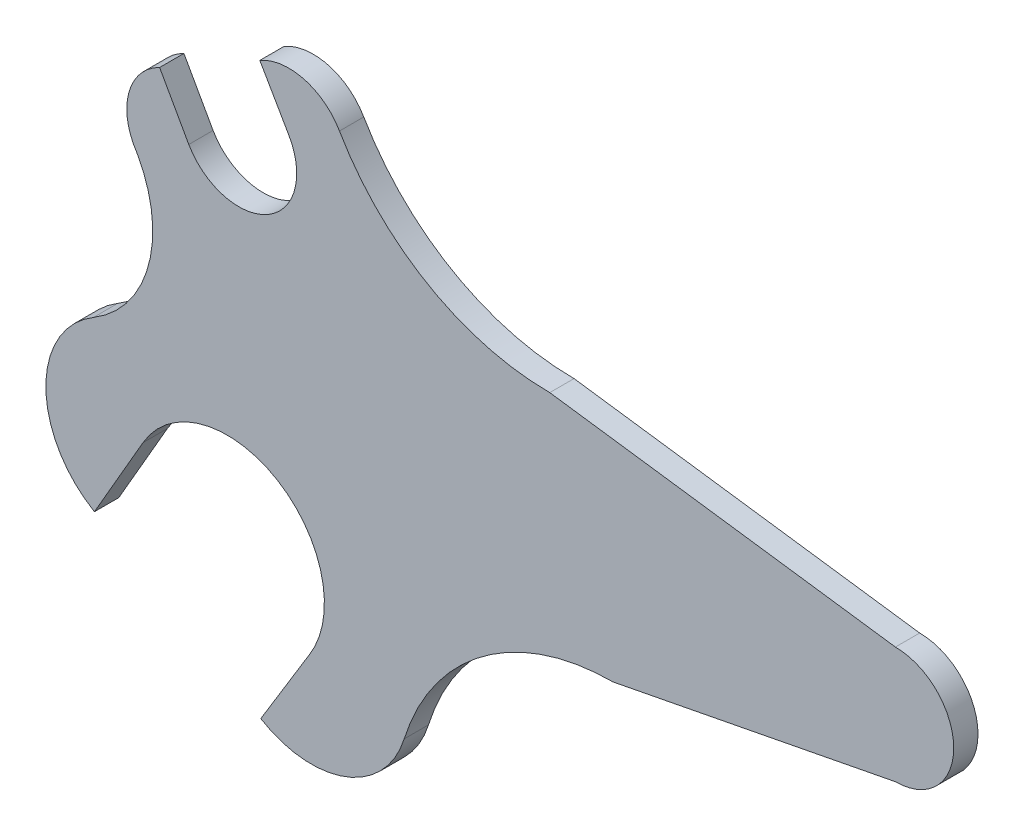
ISO-10303-21;
HEADER;
FILE_DESCRIPTION(('STEP AP214'),'2;1');
FILE_NAME('part.step','',(''),(''),'','','');
FILE_SCHEMA(('AUTOMOTIVE_DESIGN { 1 0 10303 214 1 1 1 1 }'));
ENDSEC;
DATA;
#1=APPLICATION_CONTEXT('core data for automotive mechanical design processes');
#2=APPLICATION_PROTOCOL_DEFINITION('international standard','automotive_design',2000,#1);
#3=PRODUCT_CONTEXT('',#1,'mechanical');
#4=PRODUCT('Part','Part','',(#3));
#5=PRODUCT_RELATED_PRODUCT_CATEGORY('part','',(#4));
#6=PRODUCT_DEFINITION_FORMATION('','',#4);
#7=PRODUCT_DEFINITION_CONTEXT('part definition',#1,'design');
#8=PRODUCT_DEFINITION('design','',#6,#7);
#9=PRODUCT_DEFINITION_SHAPE('','',#8);
#10=(LENGTH_UNIT() NAMED_UNIT(*) SI_UNIT(.MILLI.,.METRE.));
#11=(NAMED_UNIT(*) PLANE_ANGLE_UNIT() SI_UNIT($,.RADIAN.));
#12=(NAMED_UNIT(*) SI_UNIT($,.STERADIAN.) SOLID_ANGLE_UNIT());
#13=UNCERTAINTY_MEASURE_WITH_UNIT(LENGTH_MEASURE(1.E-05),#10,'distance_accuracy_value','');
#14=(GEOMETRIC_REPRESENTATION_CONTEXT(3) GLOBAL_UNCERTAINTY_ASSIGNED_CONTEXT((#13)) GLOBAL_UNIT_ASSIGNED_CONTEXT((#10,
#11,#12)) REPRESENTATION_CONTEXT('',''));
#15=CARTESIAN_POINT('',(0.,0.,0.));
#16=DIRECTION('',(0.,0.,1.));
#17=DIRECTION('',(1.,0.,0.));
#18=AXIS2_PLACEMENT_3D('',#15,#16,#17);
#19=CARTESIAN_POINT('',(43.8745570055947,71.7506218130229,5.));
#20=DIRECTION('',(0.,0.,-1.));
#21=DIRECTION('',(-1.,0.,0.));
#22=AXIS2_PLACEMENT_3D('',#19,#20,#21);
#23=CYLINDRICAL_SURFACE('',#22,49.9671061811762);
#24=CARTESIAN_POINT('',(43.8745570055947,71.7506218130229,0.));
#25=DIRECTION('',(0.,0.,1.));
#26=DIRECTION('',(1.,0.,0.));
#27=AXIS2_PLACEMENT_3D('',#24,#25,#26);
#28=CIRCLE('',#27,49.9671061811762);
#29=CARTESIAN_POINT('',(0.601773699101533,46.767068722435,0.));
#30=VERTEX_POINT('',#29);
#31=CARTESIAN_POINT('',(43.8745570055943,21.7835156318467,0.));
#32=VERTEX_POINT('',#31);
#33=EDGE_CURVE('E174',#30,#32,#28,.T.);
#34=ORIENTED_EDGE('',*,*,#33,.F.);
#35=DIRECTION('',(0.,0.,-1.));
#36=VECTOR('',#35,1.);
#37=CARTESIAN_POINT('',(0.601773699101533,46.767068722435,5.));
#38=LINE('',#37,#36);
#39=CARTESIAN_POINT('',(0.601773699101533,46.767068722435,5.));
#40=VERTEX_POINT('',#39);
#41=EDGE_CURVE('E11',#40,#30,#38,.T.);
#42=ORIENTED_EDGE('',*,*,#41,.F.);
#43=CARTESIAN_POINT('',(43.8745570055947,71.7506218130229,5.));
#44=DIRECTION('',(0.,0.,1.));
#45=DIRECTION('',(1.,0.,0.));
#46=AXIS2_PLACEMENT_3D('',#43,#44,#45);
#47=CIRCLE('',#46,49.9671061811762);
#48=CARTESIAN_POINT('',(43.8745570055943,21.7835156318467,5.));
#49=VERTEX_POINT('',#48);
#50=EDGE_CURVE('E217',#40,#49,#47,.T.);
#51=ORIENTED_EDGE('',*,*,#50,.T.);
#52=DIRECTION('',(0.,0.,-1.));
#53=VECTOR('',#52,1.);
#54=CARTESIAN_POINT('',(43.8745570055943,21.7835156318467,5.));
#55=LINE('',#54,#53);
#56=EDGE_CURVE('E49',#49,#32,#55,.T.);
#57=ORIENTED_EDGE('',*,*,#56,.T.);
#58=EDGE_LOOP('',(#34,#42,#51,#57));
#59=FACE_BOUND('',#58,.T.);
#60=ADVANCED_FACE('F33',(#59),#23,.F.);
#61=CARTESIAN_POINT('',(-9.79053114631223,40.7670687224347,5.));
#62=DIRECTION('',(0.,0.,-1.));
#63=DIRECTION('',(-1.,0.,0.));
#64=AXIS2_PLACEMENT_3D('',#61,#62,#63);
#65=CYLINDRICAL_SURFACE('',#64,12.0000000000006);
#66=CARTESIAN_POINT('',(-9.79053114631223,40.7670687224347,0.));
#67=DIRECTION('',(0.,0.,1.));
#68=DIRECTION('',(1.,0.,0.));
#69=AXIS2_PLACEMENT_3D('',#66,#67,#68);
#70=CIRCLE('',#69,12.0000000000006);
#71=CARTESIAN_POINT('',(-15.7905311463125,51.1593735678485,0.));
#72=VERTEX_POINT('',#71);
#73=EDGE_CURVE('E176',#30,#72,#70,.T.);
#74=ORIENTED_EDGE('',*,*,#73,.T.);
#75=DIRECTION('',(0.,0.,-1.));
#76=VECTOR('',#75,1.);
#77=CARTESIAN_POINT('',(-15.7905311463125,51.1593735678485,5.));
#78=LINE('',#77,#76);
#79=CARTESIAN_POINT('',(-15.7905311463125,51.1593735678485,5.));
#80=VERTEX_POINT('',#79);
#81=EDGE_CURVE('E41',#80,#72,#78,.T.);
#82=ORIENTED_EDGE('',*,*,#81,.F.);
#83=CARTESIAN_POINT('',(-9.79053114631223,40.7670687224347,5.));
#84=DIRECTION('',(0.,0.,1.));
#85=DIRECTION('',(1.,0.,0.));
#86=AXIS2_PLACEMENT_3D('',#83,#84,#85);
#87=CIRCLE('',#86,12.0000000000006);
#88=EDGE_CURVE('E263',#40,#80,#87,.T.);
#89=ORIENTED_EDGE('',*,*,#88,.F.);
#90=ORIENTED_EDGE('',*,*,#41,.T.);
#91=EDGE_LOOP('',(#74,#82,#89,#90));
#92=FACE_BOUND('',#91,.T.);
#93=ADVANCED_FACE('F250',(#92),#65,.T.);
#94=CARTESIAN_POINT('',(10.309760215993,5.95234283598398,5.));
#95=DIRECTION('',(-0.866025403784441,-0.499999999999997,0.));
#96=DIRECTION('',(0.499999999999997,-0.866025403784441,0.));
#97=AXIS2_PLACEMENT_3D('',#94,#95,#96);
#98=PLANE('',#97);
#99=DIRECTION('',(-0.499999999999997,0.866025403784441,0.));
#100=VECTOR('',#99,1.);
#101=CARTESIAN_POINT('',(10.309760215993,5.95234283598398,0.));
#102=LINE('',#101,#100);
#103=CARTESIAN_POINT('',(-9.79053114631223,40.7670687224347,0.));
#104=VERTEX_POINT('',#103);
#105=EDGE_CURVE('E179',#104,#72,#102,.T.);
#106=ORIENTED_EDGE('',*,*,#105,.F.);
#107=DIRECTION('',(0.,0.,-1.));
#108=VECTOR('',#107,1.);
#109=CARTESIAN_POINT('',(-9.79053114631223,40.7670687224347,5.));
#110=LINE('',#109,#108);
#111=CARTESIAN_POINT('',(-9.79053114631223,40.7670687224347,5.));
#112=VERTEX_POINT('',#111);
#113=EDGE_CURVE('E240',#112,#104,#110,.T.);
#114=ORIENTED_EDGE('',*,*,#113,.F.);
#115=DIRECTION('',(-0.499999999999997,0.866025403784441,0.));
#116=VECTOR('',#115,1.);
#117=CARTESIAN_POINT('',(10.309760215993,5.95234283598398,5.));
#118=LINE('',#117,#116);
#119=EDGE_CURVE('E247',#112,#80,#118,.T.);
#120=ORIENTED_EDGE('',*,*,#119,.T.);
#121=ORIENTED_EDGE('',*,*,#81,.T.);
#122=EDGE_LOOP('',(#106,#114,#120,#121));
#123=FACE_BOUND('',#122,.T.);
#124=ADVANCED_FACE('F245',(#123),#98,.T.);
#125=CARTESIAN_POINT('',(-20.1002913623053,34.8147258864507,5.));
#126=DIRECTION('',(0.,0.,-1.));
#127=DIRECTION('',(-1.,0.,0.));
#128=AXIS2_PLACEMENT_3D('',#125,#126,#127);
#129=CYLINDRICAL_SURFACE('',#128,11.9046856719681);
#130=CARTESIAN_POINT('',(-20.1002913623053,34.8147258864507,0.));
#131=DIRECTION('',(0.,0.,1.));
#132=DIRECTION('',(1.,0.,0.));
#133=AXIS2_PLACEMENT_3D('',#130,#131,#132);
#134=CIRCLE('',#133,11.9046856719681);
#135=CARTESIAN_POINT('',(-30.4100515782983,28.8623830504667,0.));
#136=VERTEX_POINT('',#135);
#137=EDGE_CURVE('E182',#136,#104,#134,.T.);
#138=ORIENTED_EDGE('',*,*,#137,.F.);
#139=DIRECTION('',(0.,0.,-1.));
#140=VECTOR('',#139,1.);
#141=CARTESIAN_POINT('',(-30.4100515782983,28.8623830504667,5.));
#142=LINE('',#141,#140);
#143=CARTESIAN_POINT('',(-30.4100515782983,28.8623830504667,5.));
#144=VERTEX_POINT('',#143);
#145=EDGE_CURVE('E238',#144,#136,#142,.T.);
#146=ORIENTED_EDGE('',*,*,#145,.F.);
#147=CARTESIAN_POINT('',(-20.1002913623053,34.8147258864507,5.));
#148=DIRECTION('',(0.,0.,1.));
#149=DIRECTION('',(1.,0.,0.));
#150=AXIS2_PLACEMENT_3D('',#147,#148,#149);
#151=CIRCLE('',#150,11.9046856719681);
#152=EDGE_CURVE('E260',#144,#112,#151,.T.);
#153=ORIENTED_EDGE('',*,*,#152,.T.);
#154=ORIENTED_EDGE('',*,*,#113,.T.);
#155=EDGE_LOOP('',(#138,#146,#153,#154));
#156=FACE_BOUND('',#155,.T.);
#157=ADVANCED_FACE('F257',(#156),#129,.F.);
#158=CARTESIAN_POINT('',(-10.8655081469604,-6.07784757268126,5.));
#159=DIRECTION('',(0.872740028325754,0.488185254752704,0.));
#160=DIRECTION('',(-0.488185254752704,0.872740028325754,0.));
#161=AXIS2_PLACEMENT_3D('',#158,#159,#160);
#162=PLANE('',#161);
#163=DIRECTION('',(0.488185254752704,-0.872740028325754,0.));
#164=VECTOR('',#163,1.);
#165=CARTESIAN_POINT('',(-10.8655081469604,-6.07784757268126,0.));
#166=LINE('',#165,#164);
#167=CARTESIAN_POINT('',(-36.4100515782988,39.5887212980394,0.));
#168=VERTEX_POINT('',#167);
#169=EDGE_CURVE('E185',#168,#136,#166,.T.);
#170=ORIENTED_EDGE('',*,*,#169,.F.);
#171=DIRECTION('',(0.,0.,-1.));
#172=VECTOR('',#171,1.);
#173=CARTESIAN_POINT('',(-36.4100515782988,39.5887212980394,5.));
#174=LINE('',#173,#172);
#175=CARTESIAN_POINT('',(-36.4100515782988,39.5887212980394,5.));
#176=VERTEX_POINT('',#175);
#177=EDGE_CURVE('E236',#176,#168,#174,.T.);
#178=ORIENTED_EDGE('',*,*,#177,.F.);
#179=DIRECTION('',(0.488185254752704,-0.872740028325754,0.));
#180=VECTOR('',#179,1.);
#181=CARTESIAN_POINT('',(-10.8655081469604,-6.07784757268126,5.));
#182=LINE('',#181,#180);
#183=EDGE_CURVE('E265',#176,#144,#182,.T.);
#184=ORIENTED_EDGE('',*,*,#183,.T.);
#185=ORIENTED_EDGE('',*,*,#145,.T.);
#186=EDGE_LOOP('',(#170,#178,#184,#185));
#187=FACE_BOUND('',#186,.T.);
#188=ADVANCED_FACE('F313',(#187),#162,.T.);
#189=CARTESIAN_POINT('',(-31.1619704743754,28.7971669740939,5.));
#190=DIRECTION('',(0.,0.,-1.));
#191=DIRECTION('',(-1.,0.,0.));
#192=AXIS2_PLACEMENT_3D('',#189,#190,#191);
#193=CYLINDRICAL_SURFACE('',#192,12.000000000001);
#194=CARTESIAN_POINT('',(-31.1619704743754,28.7971669740939,0.));
#195=DIRECTION('',(0.,0.,1.));
#196=DIRECTION('',(1.,0.,0.));
#197=AXIS2_PLACEMENT_3D('',#194,#195,#196);
#198=CIRCLE('',#197,12.000000000001);
#199=CARTESIAN_POINT('',(-41.0763656568723,22.036636805142,0.));
#200=VERTEX_POINT('',#199);
#201=EDGE_CURVE('E188',#168,#200,#198,.T.);
#202=ORIENTED_EDGE('',*,*,#201,.T.);
#203=DIRECTION('',(0.,0.,-1.));
#204=VECTOR('',#203,1.);
#205=CARTESIAN_POINT('',(-41.0763656568723,22.036636805142,5.));
#206=LINE('',#205,#204);
#207=CARTESIAN_POINT('',(-41.0763656568723,22.036636805142,5.));
#208=VERTEX_POINT('',#207);
#209=EDGE_CURVE('E234',#208,#200,#206,.T.);
#210=ORIENTED_EDGE('',*,*,#209,.F.);
#211=CARTESIAN_POINT('',(-31.1619704743754,28.7971669740939,5.));
#212=DIRECTION('',(0.,0.,1.));
#213=DIRECTION('',(1.,0.,0.));
#214=AXIS2_PLACEMENT_3D('',#211,#212,#213);
#215=CIRCLE('',#214,12.000000000001);
#216=EDGE_CURVE('E271',#176,#208,#215,.T.);
#217=ORIENTED_EDGE('',*,*,#216,.F.);
#218=ORIENTED_EDGE('',*,*,#177,.T.);
#219=EDGE_LOOP('',(#202,#210,#217,#218));
#220=FACE_BOUND('',#219,.T.);
#221=ADVANCED_FACE('F316',(#220),#193,.T.);
#222=CARTESIAN_POINT('',(-62.8234779954078,9.70524982171145,5.));
#223=DIRECTION('',(0.,0.,-1.));
#224=DIRECTION('',(-1.,0.,0.));
#225=AXIS2_PLACEMENT_3D('',#222,#223,#224);
#226=CYLINDRICAL_SURFACE('',#225,25.0000000000001);
#227=CARTESIAN_POINT('',(-62.8234779954078,9.70524982171145,0.));
#228=DIRECTION('',(0.,0.,1.));
#229=DIRECTION('',(1.,0.,0.));
#230=AXIS2_PLACEMENT_3D('',#227,#228,#229);
#231=CIRCLE('',#230,25.0000000000001);
#232=CARTESIAN_POINT('',(-50.0440502622305,-11.7816351738503,0.));
#233=VERTEX_POINT('',#232);
#234=EDGE_CURVE('E191',#233,#200,#231,.T.);
#235=ORIENTED_EDGE('',*,*,#234,.F.);
#236=DIRECTION('',(0.,0.,-1.));
#237=VECTOR('',#236,1.);
#238=CARTESIAN_POINT('',(-50.0440502622305,-11.7816351738503,5.));
#239=LINE('',#238,#237);
#240=CARTESIAN_POINT('',(-50.0440502622305,-11.7816351738503,5.));
#241=VERTEX_POINT('',#240);
#242=EDGE_CURVE('E232',#241,#233,#239,.T.);
#243=ORIENTED_EDGE('',*,*,#242,.F.);
#244=CARTESIAN_POINT('',(-62.8234779954078,9.70524982171145,5.));
#245=DIRECTION('',(0.,0.,1.));
#246=DIRECTION('',(1.,0.,0.));
#247=AXIS2_PLACEMENT_3D('',#244,#245,#246);
#248=CIRCLE('',#247,25.0000000000001);
#249=EDGE_CURVE('E273',#241,#208,#248,.T.);
#250=ORIENTED_EDGE('',*,*,#249,.T.);
#251=ORIENTED_EDGE('',*,*,#209,.T.);
#252=EDGE_LOOP('',(#235,#243,#250,#251));
#253=FACE_BOUND('',#252,.T.);
#254=ADVANCED_FACE('F320',(#253),#226,.F.);
#255=CARTESIAN_POINT('',(-39.8205080756887,-28.9711431702998,5.));
#256=DIRECTION('',(0.,0.,-1.));
#257=DIRECTION('',(-1.,0.,0.));
#258=AXIS2_PLACEMENT_3D('',#255,#256,#257);
#259=CYLINDRICAL_SURFACE('',#258,20.);
#260=CARTESIAN_POINT('',(-39.8205080756887,-28.9711431702998,0.));
#261=DIRECTION('',(0.,0.,1.));
#262=DIRECTION('',(1.,0.,0.));
#263=AXIS2_PLACEMENT_3D('',#260,#261,#262);
#264=CIRCLE('',#263,20.);
#265=CARTESIAN_POINT('',(-49.8205080756887,-46.2916512459886,0.));
#266=VERTEX_POINT('',#265);
#267=EDGE_CURVE('E194',#233,#266,#264,.T.);
#268=ORIENTED_EDGE('',*,*,#267,.T.);
#269=DIRECTION('',(0.,0.,-1.));
#270=VECTOR('',#269,1.);
#271=CARTESIAN_POINT('',(-49.8205080756887,-46.2916512459886,5.));
#272=LINE('',#271,#270);
#273=CARTESIAN_POINT('',(-49.8205080756887,-46.2916512459886,5.));
#274=VERTEX_POINT('',#273);
#275=EDGE_CURVE('E230',#274,#266,#272,.T.);
#276=ORIENTED_EDGE('',*,*,#275,.F.);
#277=CARTESIAN_POINT('',(-39.8205080756887,-28.9711431702998,5.));
#278=DIRECTION('',(0.,0.,1.));
#279=DIRECTION('',(1.,0.,0.));
#280=AXIS2_PLACEMENT_3D('',#277,#278,#279);
#281=CIRCLE('',#280,20.);
#282=EDGE_CURVE('E276',#241,#274,#281,.T.);
#283=ORIENTED_EDGE('',*,*,#282,.F.);
#284=ORIENTED_EDGE('',*,*,#242,.T.);
#285=EDGE_LOOP('',(#268,#276,#283,#284));
#286=FACE_BOUND('',#285,.T.);
#287=ADVANCED_FACE('F324',(#286),#259,.T.);
#288=CARTESIAN_POINT('',(-17.3205080756886,9.99999999999992,5.));
#289=DIRECTION('',(0.866025403784438,-0.500000000000002,0.));
#290=DIRECTION('',(0.500000000000002,0.866025403784438,0.));
#291=AXIS2_PLACEMENT_3D('',#288,#289,#290);
#292=PLANE('',#291);
#293=DIRECTION('',(-0.500000000000002,-0.866025403784438,0.));
#294=VECTOR('',#293,1.);
#295=CARTESIAN_POINT('',(-17.3205080756886,9.99999999999992,0.));
#296=LINE('',#295,#294);
#297=CARTESIAN_POINT('',(-39.8205080756887,-28.9711431702998,0.));
#298=VERTEX_POINT('',#297);
#299=EDGE_CURVE('E197',#298,#266,#296,.T.);
#300=ORIENTED_EDGE('',*,*,#299,.F.);
#301=DIRECTION('',(0.,0.,-1.));
#302=VECTOR('',#301,1.);
#303=CARTESIAN_POINT('',(-39.8205080756887,-28.9711431702998,5.));
#304=LINE('',#303,#302);
#305=CARTESIAN_POINT('',(-39.8205080756887,-28.9711431702998,5.));
#306=VERTEX_POINT('',#305);
#307=EDGE_CURVE('E228',#306,#298,#304,.T.);
#308=ORIENTED_EDGE('',*,*,#307,.F.);
#309=DIRECTION('',(-0.500000000000002,-0.866025403784438,0.));
#310=VECTOR('',#309,1.);
#311=CARTESIAN_POINT('',(-17.3205080756886,9.99999999999992,5.));
#312=LINE('',#311,#310);
#313=EDGE_CURVE('E278',#306,#274,#312,.T.);
#314=ORIENTED_EDGE('',*,*,#313,.T.);
#315=ORIENTED_EDGE('',*,*,#275,.T.);
#316=EDGE_LOOP('',(#300,#308,#314,#315));
#317=FACE_BOUND('',#316,.T.);
#318=ADVANCED_FACE('F328',(#317),#292,.T.);
#319=CARTESIAN_POINT('',(-22.4999999999999,-38.9711431702998,5.));
#320=DIRECTION('',(0.,0.,-1.));
#321=DIRECTION('',(-1.,0.,0.));
#322=AXIS2_PLACEMENT_3D('',#319,#320,#321);
#323=CYLINDRICAL_SURFACE('',#322,20.);
#324=CARTESIAN_POINT('',(-22.4999999999999,-38.9711431702998,0.));
#325=DIRECTION('',(0.,0.,1.));
#326=DIRECTION('',(1.,0.,0.));
#327=AXIS2_PLACEMENT_3D('',#324,#325,#326);
#328=CIRCLE('',#327,20.);
#329=CARTESIAN_POINT('',(-5.67580809383275,-49.7853267596633,0.));
#330=VERTEX_POINT('',#329);
#331=EDGE_CURVE('E200',#330,#298,#328,.T.);
#332=ORIENTED_EDGE('',*,*,#331,.F.);
#333=DIRECTION('',(0.,0.,-1.));
#334=VECTOR('',#333,1.);
#335=CARTESIAN_POINT('',(-5.67580809383275,-49.7853267596633,5.));
#336=LINE('',#335,#334);
#337=CARTESIAN_POINT('',(-5.67580809383275,-49.7853267596633,5.));
#338=VERTEX_POINT('',#337);
#339=EDGE_CURVE('E226',#338,#330,#336,.T.);
#340=ORIENTED_EDGE('',*,*,#339,.F.);
#341=CARTESIAN_POINT('',(-22.4999999999999,-38.9711431702998,5.));
#342=DIRECTION('',(0.,0.,1.));
#343=DIRECTION('',(1.,0.,0.));
#344=AXIS2_PLACEMENT_3D('',#341,#342,#343);
#345=CIRCLE('',#344,20.);
#346=EDGE_CURVE('E281',#338,#306,#345,.T.);
#347=ORIENTED_EDGE('',*,*,#346,.T.);
#348=ORIENTED_EDGE('',*,*,#307,.T.);
#349=EDGE_LOOP('',(#332,#340,#347,#348));
#350=FACE_BOUND('',#349,.T.);
#351=ADVANCED_FACE('F332',(#350),#323,.F.);
#352=CARTESIAN_POINT('',(17.9883065289622,-10.9654474853939,5.));
#353=DIRECTION('',(0.853860143615501,-0.52050250253473,0.));
#354=DIRECTION('',(0.52050250253473,0.853860143615501,0.));
#355=AXIS2_PLACEMENT_3D('',#352,#353,#354);
#356=PLANE('',#355);
#357=DIRECTION('',(-0.52050250253473,-0.853860143615501,0.));
#358=VECTOR('',#357,1.);
#359=CARTESIAN_POINT('',(17.9883065289622,-10.9654474853939,0.));
#360=LINE('',#359,#358);
#361=CARTESIAN_POINT('',(-15.5895419750057,-66.0483460426098,0.));
#362=VERTEX_POINT('',#361);
#363=EDGE_CURVE('E203',#330,#362,#360,.T.);
#364=ORIENTED_EDGE('',*,*,#363,.T.);
#365=DIRECTION('',(0.,0.,-1.));
#366=VECTOR('',#365,1.);
#367=CARTESIAN_POINT('',(-15.5895419750057,-66.0483460426098,5.));
#368=LINE('',#367,#366);
#369=CARTESIAN_POINT('',(-15.5895419750057,-66.0483460426098,5.));
#370=VERTEX_POINT('',#369);
#371=EDGE_CURVE('E223',#370,#362,#368,.T.);
#372=ORIENTED_EDGE('',*,*,#371,.F.);
#373=DIRECTION('',(-0.52050250253473,-0.853860143615501,0.));
#374=VECTOR('',#373,1.);
#375=CARTESIAN_POINT('',(17.9883065289622,-10.9654474853939,5.));
#376=LINE('',#375,#374);
#377=EDGE_CURVE('E284',#338,#370,#376,.T.);
#378=ORIENTED_EDGE('',*,*,#377,.F.);
#379=ORIENTED_EDGE('',*,*,#339,.T.);
#380=EDGE_LOOP('',(#364,#372,#378,#379));
#381=FACE_BOUND('',#380,.T.);
#382=ADVANCED_FACE('F336',(#381),#356,.F.);
#383=CARTESIAN_POINT('',(-5.17949192431115,-48.9711431702998,5.));
#384=DIRECTION('',(0.,0.,-1.));
#385=DIRECTION('',(-1.,0.,0.));
#386=AXIS2_PLACEMENT_3D('',#383,#384,#385);
#387=CYLINDRICAL_SURFACE('',#386,20.);
#388=CARTESIAN_POINT('',(-5.17949192431115,-48.9711431702998,0.));
#389=DIRECTION('',(0.,0.,1.));
#390=DIRECTION('',(1.,0.,0.));
#391=AXIS2_PLACEMENT_3D('',#388,#389,#390);
#392=CIRCLE('',#391,20.);
#393=CARTESIAN_POINT('',(13.9184793828487,-54.9097871191233,0.));
#394=VERTEX_POINT('',#393);
#395=EDGE_CURVE('E205',#362,#394,#392,.T.);
#396=ORIENTED_EDGE('',*,*,#395,.T.);
#397=DIRECTION('',(0.,0.,-1.));
#398=VECTOR('',#397,1.);
#399=CARTESIAN_POINT('',(13.9184793828487,-54.9097871191233,5.));
#400=LINE('',#399,#398);
#401=CARTESIAN_POINT('',(13.9184793828487,-54.9097871191233,5.));
#402=VERTEX_POINT('',#401);
#403=EDGE_CURVE('E221',#402,#394,#400,.T.);
#404=ORIENTED_EDGE('',*,*,#403,.F.);
#405=CARTESIAN_POINT('',(-5.17949192431115,-48.9711431702998,5.));
#406=DIRECTION('',(0.,0.,1.));
#407=DIRECTION('',(1.,0.,0.));
#408=AXIS2_PLACEMENT_3D('',#405,#406,#407);
#409=CIRCLE('',#408,20.);
#410=EDGE_CURVE('E286',#370,#402,#409,.T.);
#411=ORIENTED_EDGE('',*,*,#410,.F.);
#412=ORIENTED_EDGE('',*,*,#371,.T.);
#413=EDGE_LOOP('',(#396,#404,#411,#412));
#414=FACE_BOUND('',#413,.T.);
#415=ADVANCED_FACE('F340',(#414),#387,.T.);
#416=CARTESIAN_POINT('',(56.8889148239585,-68.2717360039762,5.));
#417=DIRECTION('',(0.,0.,-1.));
#418=DIRECTION('',(-1.,0.,0.));
#419=AXIS2_PLACEMENT_3D('',#416,#417,#418);
#420=CYLINDRICAL_SURFACE('',#419,45.);
#421=CARTESIAN_POINT('',(56.8889148239585,-68.2717360039762,0.));
#422=DIRECTION('',(0.,0.,1.));
#423=DIRECTION('',(1.,0.,0.));
#424=AXIS2_PLACEMENT_3D('',#421,#422,#423);
#425=CIRCLE('',#424,45.);
#426=CARTESIAN_POINT('',(56.8889148239585,-23.2717360039762,0.));
#427=VERTEX_POINT('',#426);
#428=EDGE_CURVE('E208',#427,#394,#425,.T.);
#429=ORIENTED_EDGE('',*,*,#428,.F.);
#430=DIRECTION('',(0.,0.,-1.));
#431=VECTOR('',#430,1.);
#432=CARTESIAN_POINT('',(56.8889148239585,-23.2717360039762,5.));
#433=LINE('',#432,#431);
#434=CARTESIAN_POINT('',(56.8889148239585,-23.2717360039762,5.));
#435=VERTEX_POINT('',#434);
#436=EDGE_CURVE('E166',#435,#427,#433,.T.);
#437=ORIENTED_EDGE('',*,*,#436,.F.);
#438=CARTESIAN_POINT('',(56.8889148239585,-68.2717360039762,5.));
#439=DIRECTION('',(0.,0.,1.));
#440=DIRECTION('',(1.,0.,0.));
#441=AXIS2_PLACEMENT_3D('',#438,#439,#440);
#442=CIRCLE('',#441,45.);
#443=EDGE_CURVE('E156',#435,#402,#442,.T.);
#444=ORIENTED_EDGE('',*,*,#443,.T.);
#445=ORIENTED_EDGE('',*,*,#403,.T.);
#446=EDGE_LOOP('',(#429,#437,#444,#445));
#447=FACE_BOUND('',#446,.T.);
#448=ADVANCED_FACE('F289',(#447),#420,.F.);
#449=CARTESIAN_POINT('',(6.41308690273712,-33.0624705116275,5.));
#450=DIRECTION('',(-0.190419685154976,0.98170277757857,0.));
#451=DIRECTION('',(-0.98170277757857,-0.190419685154976,0.));
#452=AXIS2_PLACEMENT_3D('',#449,#450,#451);
#453=PLANE('',#452);
#454=DIRECTION('',(0.98170277757857,0.190419685154976,0.));
#455=VECTOR('',#454,1.);
#456=CARTESIAN_POINT('',(6.41308690273712,-33.0624705116275,0.));
#457=LINE('',#456,#455);
#458=CARTESIAN_POINT('',(115.,-12.,0.));
#459=VERTEX_POINT('',#458);
#460=EDGE_CURVE('E163',#427,#459,#457,.T.);
#461=ORIENTED_EDGE('',*,*,#460,.T.);
#462=DIRECTION('',(0.,0.,-1.));
#463=VECTOR('',#462,1.);
#464=CARTESIAN_POINT('',(115.,-12.,5.));
#465=LINE('',#464,#463);
#466=CARTESIAN_POINT('',(115.,-12.,5.));
#467=VERTEX_POINT('',#466);
#468=EDGE_CURVE('E160',#467,#459,#465,.T.);
#469=ORIENTED_EDGE('',*,*,#468,.F.);
#470=DIRECTION('',(0.98170277757857,0.190419685154976,0.));
#471=VECTOR('',#470,1.);
#472=CARTESIAN_POINT('',(6.41308690273712,-33.0624705116275,5.));
#473=LINE('',#472,#471);
#474=EDGE_CURVE('E148',#435,#467,#473,.T.);
#475=ORIENTED_EDGE('',*,*,#474,.F.);
#476=ORIENTED_EDGE('',*,*,#436,.T.);
#477=EDGE_LOOP('',(#461,#469,#475,#476));
#478=FACE_BOUND('',#477,.T.);
#479=ADVANCED_FACE('F161',(#478),#453,.F.);
#480=CARTESIAN_POINT('',(115.,0.,5.));
#481=DIRECTION('',(0.,0.,-1.));
#482=DIRECTION('',(-1.,0.,0.));
#483=AXIS2_PLACEMENT_3D('',#480,#481,#482);
#484=CYLINDRICAL_SURFACE('',#483,12.);
#485=CARTESIAN_POINT('',(115.,0.,0.));
#486=DIRECTION('',(0.,0.,1.));
#487=DIRECTION('',(1.,0.,0.));
#488=AXIS2_PLACEMENT_3D('',#485,#486,#487);
#489=CIRCLE('',#488,12.);
#490=CARTESIAN_POINT('',(115.,12.,0.));
#491=VERTEX_POINT('',#490);
#492=EDGE_CURVE('E212',#459,#491,#489,.T.);
#493=ORIENTED_EDGE('',*,*,#492,.T.);
#494=DIRECTION('',(0.,0.,-1.));
#495=VECTOR('',#494,1.);
#496=CARTESIAN_POINT('',(115.,12.,5.));
#497=LINE('',#496,#495);
#498=CARTESIAN_POINT('',(115.,12.,5.));
#499=VERTEX_POINT('',#498);
#500=EDGE_CURVE('E99',#499,#491,#497,.T.);
#501=ORIENTED_EDGE('',*,*,#500,.F.);
#502=CARTESIAN_POINT('',(115.,0.,5.));
#503=DIRECTION('',(0.,0.,1.));
#504=DIRECTION('',(1.,0.,0.));
#505=AXIS2_PLACEMENT_3D('',#502,#503,#504);
#506=CIRCLE('',#505,12.);
#507=EDGE_CURVE('E154',#467,#499,#506,.T.);
#508=ORIENTED_EDGE('',*,*,#507,.F.);
#509=ORIENTED_EDGE('',*,*,#468,.T.);
#510=EDGE_LOOP('',(#493,#501,#508,#509));
#511=FACE_BOUND('',#510,.T.);
#512=ADVANCED_FACE('F168',(#511),#484,.T.);
#513=CARTESIAN_POINT('',(3.75547308388779,27.3020146127846,5.));
#514=DIRECTION('',(0.136269838437582,0.990671757512142,0.));
#515=DIRECTION('',(-0.990671757512142,0.136269838437582,0.));
#516=AXIS2_PLACEMENT_3D('',#513,#514,#515);
#517=PLANE('',#516);
#518=DIRECTION('',(0.990671757512142,-0.136269838437582,0.));
#519=VECTOR('',#518,1.);
#520=CARTESIAN_POINT('',(3.75547308388779,27.3020146127846,0.));
#521=LINE('',#520,#519);
#522=EDGE_CURVE('E214',#32,#491,#521,.T.);
#523=ORIENTED_EDGE('',*,*,#522,.F.);
#524=ORIENTED_EDGE('',*,*,#56,.F.);
#525=DIRECTION('',(0.990671757512142,-0.136269838437582,0.));
#526=VECTOR('',#525,1.);
#527=CARTESIAN_POINT('',(3.75547308388779,27.3020146127846,5.));
#528=LINE('',#527,#526);
#529=EDGE_CURVE('E169',#49,#499,#528,.T.);
#530=ORIENTED_EDGE('',*,*,#529,.T.);
#531=ORIENTED_EDGE('',*,*,#500,.T.);
#532=EDGE_LOOP('',(#523,#524,#530,#531));
#533=FACE_BOUND('',#532,.T.);
#534=ADVANCED_FACE('F292',(#533),#517,.T.);
#535=CARTESIAN_POINT('',(0.,0.,5.));
#536=DIRECTION('',(0.,0.,1.));
#537=DIRECTION('',(1.,0.,0.));
#538=AXIS2_PLACEMENT_3D('',#535,#536,#537);
#539=PLANE('',#538);
#540=ORIENTED_EDGE('',*,*,#50,.F.);
#541=ORIENTED_EDGE('',*,*,#88,.T.);
#542=ORIENTED_EDGE('',*,*,#119,.F.);
#543=ORIENTED_EDGE('',*,*,#152,.F.);
#544=ORIENTED_EDGE('',*,*,#183,.F.);
#545=ORIENTED_EDGE('',*,*,#216,.T.);
#546=ORIENTED_EDGE('',*,*,#249,.F.);
#547=ORIENTED_EDGE('',*,*,#282,.T.);
#548=ORIENTED_EDGE('',*,*,#313,.F.);
#549=ORIENTED_EDGE('',*,*,#346,.F.);
#550=ORIENTED_EDGE('',*,*,#377,.T.);
#551=ORIENTED_EDGE('',*,*,#410,.T.);
#552=ORIENTED_EDGE('',*,*,#443,.F.);
#553=ORIENTED_EDGE('',*,*,#474,.T.);
#554=ORIENTED_EDGE('',*,*,#507,.T.);
#555=ORIENTED_EDGE('',*,*,#529,.F.);
#556=EDGE_LOOP('',(#540,#541,#542,#543,#544,#545,#546,#547,#548,#549,#550,#551,#552,#553,#554,#555));
#557=FACE_BOUND('',#556,.T.);
#558=ADVANCED_FACE('F151',(#557),#539,.T.);
#559=CARTESIAN_POINT('',(0.,0.,0.));
#560=DIRECTION('',(0.,0.,1.));
#561=DIRECTION('',(1.,0.,0.));
#562=AXIS2_PLACEMENT_3D('',#559,#560,#561);
#563=PLANE('',#562);
#564=ORIENTED_EDGE('',*,*,#33,.T.);
#565=ORIENTED_EDGE('',*,*,#522,.T.);
#566=ORIENTED_EDGE('',*,*,#492,.F.);
#567=ORIENTED_EDGE('',*,*,#460,.F.);
#568=ORIENTED_EDGE('',*,*,#428,.T.);
#569=ORIENTED_EDGE('',*,*,#395,.F.);
#570=ORIENTED_EDGE('',*,*,#363,.F.);
#571=ORIENTED_EDGE('',*,*,#331,.T.);
#572=ORIENTED_EDGE('',*,*,#299,.T.);
#573=ORIENTED_EDGE('',*,*,#267,.F.);
#574=ORIENTED_EDGE('',*,*,#234,.T.);
#575=ORIENTED_EDGE('',*,*,#201,.F.);
#576=ORIENTED_EDGE('',*,*,#169,.T.);
#577=ORIENTED_EDGE('',*,*,#137,.T.);
#578=ORIENTED_EDGE('',*,*,#105,.T.);
#579=ORIENTED_EDGE('',*,*,#73,.F.);
#580=EDGE_LOOP('',(#564,#565,#566,#567,#568,#569,#570,#571,#572,#573,#574,#575,#576,#577,#578,#579));
#581=FACE_BOUND('',#580,.T.);
#582=ADVANCED_FACE('F252',(#581),#563,.F.);
#583=CLOSED_SHELL('',(#60,#93,#124,#157,#188,#221,#254,#287,#318,#351,#382,#415,#448,#479,#512,
#534,#558,#582));
#584=MANIFOLD_SOLID_BREP('B2',#583);
#585=ADVANCED_BREP_SHAPE_REPRESENTATION('',(#18,#584),#14);
#586=SHAPE_DEFINITION_REPRESENTATION(#9,#585);
ENDSEC;
END-ISO-10303-21;
